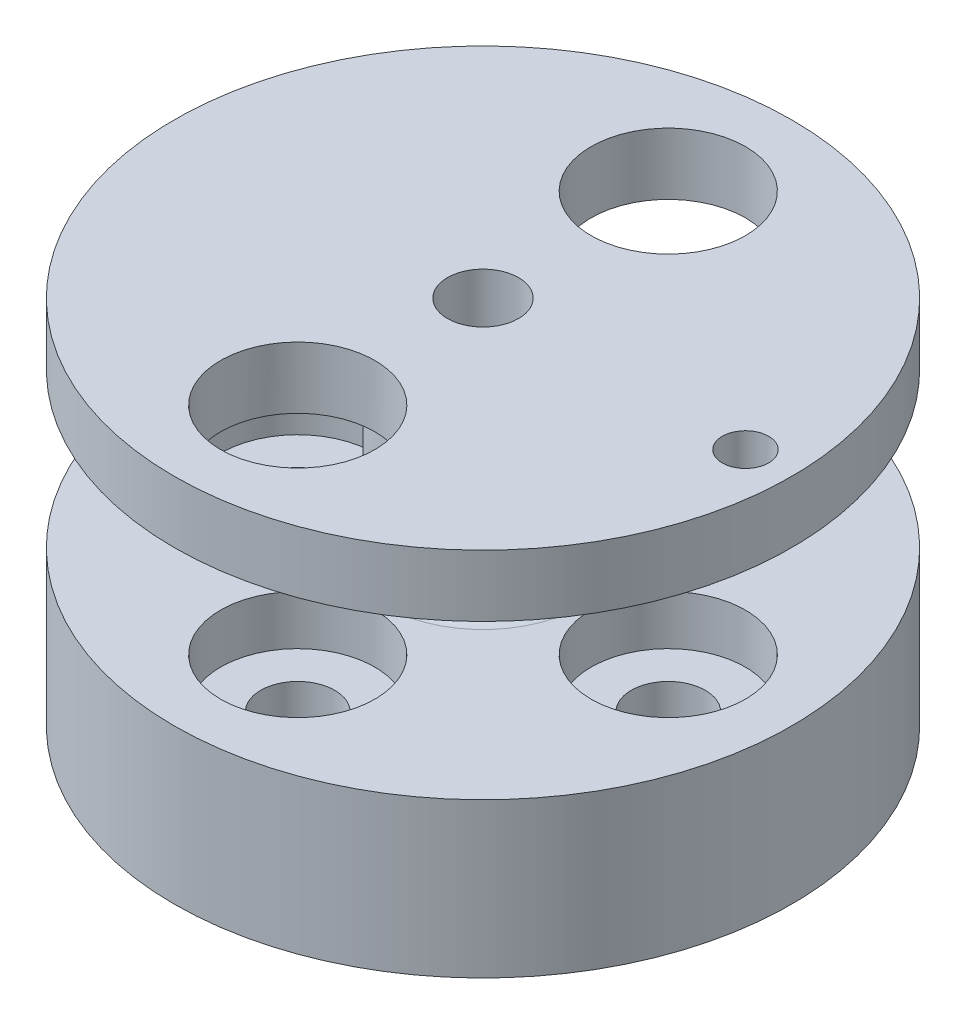
ISO-10303-21;
HEADER;
FILE_DESCRIPTION(('STEP AP214'),'2;1');
FILE_NAME('part.step','',(''),(''),'','','');
FILE_SCHEMA(('AUTOMOTIVE_DESIGN { 1 0 10303 214 1 1 1 1 }'));
ENDSEC;
DATA;
#1=APPLICATION_CONTEXT('core data for automotive mechanical design processes');
#2=APPLICATION_PROTOCOL_DEFINITION('international standard','automotive_design',2000,#1);
#3=PRODUCT_CONTEXT('',#1,'mechanical');
#4=PRODUCT('Part','Part','',(#3));
#5=PRODUCT_RELATED_PRODUCT_CATEGORY('part','',(#4));
#6=PRODUCT_DEFINITION_FORMATION('','',#4);
#7=PRODUCT_DEFINITION_CONTEXT('part definition',#1,'design');
#8=PRODUCT_DEFINITION('design','',#6,#7);
#9=PRODUCT_DEFINITION_SHAPE('','',#8);
#10=(LENGTH_UNIT() NAMED_UNIT(*) SI_UNIT(.MILLI.,.METRE.));
#11=(NAMED_UNIT(*) PLANE_ANGLE_UNIT() SI_UNIT($,.RADIAN.));
#12=(NAMED_UNIT(*) SI_UNIT($,.STERADIAN.) SOLID_ANGLE_UNIT());
#13=UNCERTAINTY_MEASURE_WITH_UNIT(LENGTH_MEASURE(1.E-05),#10,'distance_accuracy_value','');
#14=(GEOMETRIC_REPRESENTATION_CONTEXT(3) GLOBAL_UNCERTAINTY_ASSIGNED_CONTEXT((#13)) GLOBAL_UNIT_ASSIGNED_CONTEXT((#10,
#11,#12)) REPRESENTATION_CONTEXT('',''));
#15=CARTESIAN_POINT('',(0.,0.,0.));
#16=DIRECTION('',(0.,0.,1.));
#17=DIRECTION('',(1.,0.,0.));
#18=AXIS2_PLACEMENT_3D('',#15,#16,#17);
#19=CARTESIAN_POINT('',(0.,10.,10.));
#20=DIRECTION('',(0.,-1.,0.));
#21=DIRECTION('',(0.,0.,-1.));
#22=AXIS2_PLACEMENT_3D('',#19,#20,#21);
#23=PLANE('',#22);
#24=CARTESIAN_POINT('',(0.,10.,-6.));
#25=DIRECTION('',(0.,-1.,0.));
#26=DIRECTION('',(0.,0.,-1.));
#27=AXIS2_PLACEMENT_3D('',#24,#25,#26);
#28=CIRCLE('',#27,2.5);
#29=CARTESIAN_POINT('',(0.,10.,-8.5));
#30=VERTEX_POINT('',#29);
#31=EDGE_CURVE('E81',#30,#30,#28,.F.);
#32=ORIENTED_EDGE('',*,*,#31,.T.);
#33=EDGE_LOOP('',(#32));
#34=FACE_BOUND('',#33,.T.);
#35=CARTESIAN_POINT('',(0.,10.,6.));
#36=DIRECTION('',(0.,-1.,0.));
#37=DIRECTION('',(0.,0.,-1.));
#38=AXIS2_PLACEMENT_3D('',#35,#36,#37);
#39=CIRCLE('',#38,2.5);
#40=CARTESIAN_POINT('',(0.,10.,3.5));
#41=VERTEX_POINT('',#40);
#42=EDGE_CURVE('E75',#41,#41,#39,.F.);
#43=ORIENTED_EDGE('',*,*,#42,.T.);
#44=EDGE_LOOP('',(#43));
#45=FACE_BOUND('',#44,.T.);
#46=CARTESIAN_POINT('',(0.,10.,0.));
#47=DIRECTION('',(0.,-1.,0.));
#48=DIRECTION('',(0.,0.,-1.));
#49=AXIS2_PLACEMENT_3D('',#46,#47,#48);
#50=CIRCLE('',#49,1.15);
#51=CARTESIAN_POINT('',(0.,10.,-1.15));
#52=VERTEX_POINT('',#51);
#53=EDGE_CURVE('E56',#52,#52,#50,.T.);
#54=ORIENTED_EDGE('',*,*,#53,.F.);
#55=EDGE_LOOP('',(#54));
#56=FACE_BOUND('',#55,.T.);
#57=CARTESIAN_POINT('',(8.5,10.,0.));
#58=DIRECTION('',(0.,1.,0.));
#59=DIRECTION('',(0.,0.,1.));
#60=AXIS2_PLACEMENT_3D('',#57,#58,#59);
#61=CIRCLE('',#60,0.75);
#62=CARTESIAN_POINT('',(8.5,10.,0.75));
#63=VERTEX_POINT('',#62);
#64=EDGE_CURVE('E64',#63,#63,#61,.F.);
#65=ORIENTED_EDGE('',*,*,#64,.F.);
#66=EDGE_LOOP('',(#65));
#67=FACE_BOUND('',#66,.T.);
#68=CARTESIAN_POINT('',(0.,10.,0.));
#69=DIRECTION('',(0.,1.,0.));
#70=DIRECTION('',(0.,0.,1.));
#71=AXIS2_PLACEMENT_3D('',#68,#69,#70);
#72=CIRCLE('',#71,10.);
#73=CARTESIAN_POINT('',(0.,10.,10.));
#74=VERTEX_POINT('',#73);
#75=EDGE_CURVE('E69',#74,#74,#72,.T.);
#76=ORIENTED_EDGE('',*,*,#75,.F.);
#77=EDGE_LOOP('',(#76));
#78=FACE_BOUND('',#77,.T.);
#79=ADVANCED_FACE('F52',(#34,#45,#56,#67,#78),#23,.T.);
#80=CARTESIAN_POINT('',(0.,12.,0.));
#81=DIRECTION('',(0.,1.,0.));
#82=DIRECTION('',(0.,0.,1.));
#83=AXIS2_PLACEMENT_3D('',#80,#81,#82);
#84=PLANE('',#83);
#85=CARTESIAN_POINT('',(0.,12.,-6.));
#86=DIRECTION('',(0.,1.,0.));
#87=DIRECTION('',(0.,0.,-1.));
#88=AXIS2_PLACEMENT_3D('',#85,#86,#87);
#89=CIRCLE('',#88,2.5);
#90=CARTESIAN_POINT('',(0.,12.,-8.5));
#91=VERTEX_POINT('',#90);
#92=EDGE_CURVE('E84',#91,#91,#89,.T.);
#93=ORIENTED_EDGE('',*,*,#92,.F.);
#94=EDGE_LOOP('',(#93));
#95=FACE_BOUND('',#94,.T.);
#96=CARTESIAN_POINT('',(0.,12.,6.));
#97=DIRECTION('',(0.,1.,0.));
#98=DIRECTION('',(0.,0.,1.));
#99=AXIS2_PLACEMENT_3D('',#96,#97,#98);
#100=CIRCLE('',#99,2.5);
#101=CARTESIAN_POINT('',(0.,12.,8.5));
#102=VERTEX_POINT('',#101);
#103=EDGE_CURVE('E78',#102,#102,#100,.T.);
#104=ORIENTED_EDGE('',*,*,#103,.F.);
#105=EDGE_LOOP('',(#104));
#106=FACE_BOUND('',#105,.T.);
#107=CARTESIAN_POINT('',(0.,12.,0.));
#108=DIRECTION('',(0.,1.,0.));
#109=DIRECTION('',(0.,0.,1.));
#110=AXIS2_PLACEMENT_3D('',#107,#108,#109);
#111=CIRCLE('',#110,1.15);
#112=CARTESIAN_POINT('',(0.,12.,1.15));
#113=VERTEX_POINT('',#112);
#114=EDGE_CURVE('E12',#113,#113,#111,.T.);
#115=ORIENTED_EDGE('',*,*,#114,.F.);
#116=EDGE_LOOP('',(#115));
#117=FACE_BOUND('',#116,.T.);
#118=CARTESIAN_POINT('',(8.5,12.,0.));
#119=DIRECTION('',(0.,1.,0.));
#120=DIRECTION('',(0.,0.,1.));
#121=AXIS2_PLACEMENT_3D('',#118,#119,#120);
#122=CIRCLE('',#121,0.75);
#123=CARTESIAN_POINT('',(8.5,12.,0.75));
#124=VERTEX_POINT('',#123);
#125=EDGE_CURVE('E60',#124,#124,#122,.T.);
#126=ORIENTED_EDGE('',*,*,#125,.F.);
#127=EDGE_LOOP('',(#126));
#128=FACE_BOUND('',#127,.T.);
#129=CARTESIAN_POINT('',(0.,12.,0.));
#130=DIRECTION('',(0.,1.,0.));
#131=DIRECTION('',(0.,0.,1.));
#132=AXIS2_PLACEMENT_3D('',#129,#130,#131);
#133=CIRCLE('',#132,10.);
#134=CARTESIAN_POINT('',(0.,12.,10.));
#135=VERTEX_POINT('',#134);
#136=EDGE_CURVE('E70',#135,#135,#133,.T.);
#137=ORIENTED_EDGE('',*,*,#136,.T.);
#138=EDGE_LOOP('',(#137));
#139=FACE_BOUND('',#138,.T.);
#140=ADVANCED_FACE('F91',(#95,#106,#117,#128,#139),#84,.T.);
#141=CARTESIAN_POINT('',(0.,15.2526911934581,0.));
#142=DIRECTION('',(0.,-1.,0.));
#143=DIRECTION('',(0.,0.,-1.));
#144=AXIS2_PLACEMENT_3D('',#141,#142,#143);
#145=CYLINDRICAL_SURFACE('',#144,1.15);
#146=ORIENTED_EDGE('',*,*,#114,.T.);
#147=EDGE_LOOP('',(#146));
#148=FACE_BOUND('',#147,.T.);
#149=ORIENTED_EDGE('',*,*,#53,.T.);
#150=EDGE_LOOP('',(#149));
#151=FACE_BOUND('',#150,.T.);
#152=ADVANCED_FACE('F54',(#148,#151),#145,.F.);
#153=CARTESIAN_POINT('',(8.5,7.87867965644036,0.));
#154=DIRECTION('',(0.,1.,0.));
#155=DIRECTION('',(0.,0.,1.));
#156=AXIS2_PLACEMENT_3D('',#153,#154,#155);
#157=CYLINDRICAL_SURFACE('',#156,0.75);
#158=ORIENTED_EDGE('',*,*,#64,.T.);
#159=EDGE_LOOP('',(#158));
#160=FACE_BOUND('',#159,.T.);
#161=ORIENTED_EDGE('',*,*,#125,.T.);
#162=EDGE_LOOP('',(#161));
#163=FACE_BOUND('',#162,.T.);
#164=ADVANCED_FACE('F106',(#160,#163),#157,.F.);
#165=CARTESIAN_POINT('',(0.,12.,0.));
#166=DIRECTION('',(0.,-1.,0.));
#167=DIRECTION('',(0.,0.,-1.));
#168=AXIS2_PLACEMENT_3D('',#165,#166,#167);
#169=CYLINDRICAL_SURFACE('',#168,10.);
#170=ORIENTED_EDGE('',*,*,#136,.F.);
#171=EDGE_LOOP('',(#170));
#172=FACE_BOUND('',#171,.T.);
#173=ORIENTED_EDGE('',*,*,#75,.T.);
#174=EDGE_LOOP('',(#173));
#175=FACE_BOUND('',#174,.T.);
#176=ADVANCED_FACE('F102',(#172,#175),#169,.T.);
#177=CARTESIAN_POINT('',(0.,2.92893218813453,6.));
#178=DIRECTION('',(0.,1.,0.));
#179=DIRECTION('',(0.,0.,1.));
#180=AXIS2_PLACEMENT_3D('',#177,#178,#179);
#181=CYLINDRICAL_SURFACE('',#180,2.5);
#182=ORIENTED_EDGE('',*,*,#103,.T.);
#183=EDGE_LOOP('',(#182));
#184=FACE_BOUND('',#183,.T.);
#185=ORIENTED_EDGE('',*,*,#42,.F.);
#186=EDGE_LOOP('',(#185));
#187=FACE_BOUND('',#186,.T.);
#188=ADVANCED_FACE('F105',(#184,#187),#181,.F.);
#189=CARTESIAN_POINT('',(0.,2.92893218813453,-6.));
#190=DIRECTION('',(0.,1.,0.));
#191=DIRECTION('',(0.,0.,1.));
#192=AXIS2_PLACEMENT_3D('',#189,#190,#191);
#193=CYLINDRICAL_SURFACE('',#192,2.5);
#194=ORIENTED_EDGE('',*,*,#92,.T.);
#195=EDGE_LOOP('',(#194));
#196=FACE_BOUND('',#195,.T.);
#197=ORIENTED_EDGE('',*,*,#31,.F.);
#198=EDGE_LOOP('',(#197));
#199=FACE_BOUND('',#198,.T.);
#200=ADVANCED_FACE('F88',(#196,#199),#193,.F.);
#201=CLOSED_SHELL('',(#79,#140,#152,#164,#176,#188,#200));
#202=MANIFOLD_SOLID_BREP('B2',#201);
#203=CARTESIAN_POINT('',(0.,10.,10.));
#204=DIRECTION('',(0.,-1.,0.));
#205=DIRECTION('',(0.,0.,-1.));
#206=AXIS2_PLACEMENT_3D('',#203,#204,#205);
#207=PLANE('',#206);
#208=CARTESIAN_POINT('',(0.,10.,0.));
#209=DIRECTION('',(0.,1.,0.));
#210=DIRECTION('',(0.,0.,1.));
#211=AXIS2_PLACEMENT_3D('',#208,#209,#210);
#212=CIRCLE('',#211,2.75);
#213=CARTESIAN_POINT('',(0.,10.,2.75));
#214=VERTEX_POINT('',#213);
#215=EDGE_CURVE('E51',#214,#214,#212,.T.);
#216=ORIENTED_EDGE('',*,*,#215,.T.);
#217=EDGE_LOOP('',(#216));
#218=FACE_BOUND('',#217,.T.);
#219=CARTESIAN_POINT('',(0.,10.,0.));
#220=DIRECTION('',(0.,-1.,0.));
#221=DIRECTION('',(0.,0.,-1.));
#222=AXIS2_PLACEMENT_3D('',#219,#220,#221);
#223=CIRCLE('',#222,1.15);
#224=CARTESIAN_POINT('',(0.,10.,-1.15));
#225=VERTEX_POINT('',#224);
#226=EDGE_CURVE('E183',#225,#225,#223,.T.);
#227=ORIENTED_EDGE('',*,*,#226,.T.);
#228=EDGE_LOOP('',(#227));
#229=FACE_BOUND('',#228,.T.);
#230=ADVANCED_FACE('F180',(#218,#229),#207,.F.);
#231=CARTESIAN_POINT('',(0.,5.,0.));
#232=DIRECTION('',(0.,1.,0.));
#233=DIRECTION('',(0.,0.,1.));
#234=AXIS2_PLACEMENT_3D('',#231,#232,#233);
#235=PLANE('',#234);
#236=CARTESIAN_POINT('',(0.,5.,0.));
#237=DIRECTION('',(0.,1.,0.));
#238=DIRECTION('',(0.,0.,1.));
#239=AXIS2_PLACEMENT_3D('',#236,#237,#238);
#240=CIRCLE('',#239,1.15);
#241=CARTESIAN_POINT('',(0.,5.,1.15));
#242=VERTEX_POINT('',#241);
#243=EDGE_CURVE('E272',#242,#242,#240,.T.);
#244=ORIENTED_EDGE('',*,*,#243,.T.);
#245=EDGE_LOOP('',(#244));
#246=FACE_BOUND('',#245,.T.);
#247=ADVANCED_FACE('F256',(#246),#235,.T.);
#248=CARTESIAN_POINT('',(0.,15.2526911934581,0.));
#249=DIRECTION('',(0.,-1.,0.));
#250=DIRECTION('',(0.,0.,-1.));
#251=AXIS2_PLACEMENT_3D('',#248,#249,#250);
#252=CYLINDRICAL_SURFACE('',#251,1.15);
#253=ORIENTED_EDGE('',*,*,#226,.F.);
#254=EDGE_LOOP('',(#253));
#255=FACE_BOUND('',#254,.T.);
#256=ORIENTED_EDGE('',*,*,#243,.F.);
#257=EDGE_LOOP('',(#256));
#258=FACE_BOUND('',#257,.T.);
#259=ADVANCED_FACE('F261',(#255,#258),#252,.F.);
#260=CARTESIAN_POINT('',(0.,5.,0.));
#261=DIRECTION('',(0.,-1.,0.));
#262=DIRECTION('',(0.,0.,-1.));
#263=AXIS2_PLACEMENT_3D('',#260,#261,#262);
#264=CYLINDRICAL_SURFACE('',#263,10.);
#265=CARTESIAN_POINT('',(0.,5.,0.));
#266=DIRECTION('',(0.,1.,0.));
#267=DIRECTION('',(0.,0.,1.));
#268=AXIS2_PLACEMENT_3D('',#265,#266,#267);
#269=CIRCLE('',#268,10.);
#270=CARTESIAN_POINT('',(0.,5.,10.));
#271=VERTEX_POINT('',#270);
#272=EDGE_CURVE('E215',#271,#271,#269,.T.);
#273=ORIENTED_EDGE('',*,*,#272,.F.);
#274=EDGE_LOOP('',(#273));
#275=FACE_BOUND('',#274,.T.);
#276=CARTESIAN_POINT('',(0.,0.,0.));
#277=DIRECTION('',(0.,1.,0.));
#278=DIRECTION('',(0.,0.,1.));
#279=AXIS2_PLACEMENT_3D('',#276,#277,#278);
#280=CIRCLE('',#279,10.);
#281=CARTESIAN_POINT('',(0.,0.,10.));
#282=VERTEX_POINT('',#281);
#283=EDGE_CURVE('E214',#282,#282,#280,.T.);
#284=ORIENTED_EDGE('',*,*,#283,.T.);
#285=EDGE_LOOP('',(#284));
#286=FACE_BOUND('',#285,.T.);
#287=ADVANCED_FACE('F268',(#275,#286),#264,.T.);
#288=CARTESIAN_POINT('',(0.,5.,0.));
#289=DIRECTION('',(0.,1.,0.));
#290=DIRECTION('',(0.,0.,1.));
#291=AXIS2_PLACEMENT_3D('',#288,#289,#290);
#292=PLANE('',#291);
#293=CARTESIAN_POINT('',(0.,5.,0.));
#294=DIRECTION('',(0.,1.,0.));
#295=DIRECTION('',(0.,0.,1.));
#296=AXIS2_PLACEMENT_3D('',#293,#294,#295);
#297=CIRCLE('',#296,3.25);
#298=CARTESIAN_POINT('',(0.,5.,3.25));
#299=VERTEX_POINT('',#298);
#300=EDGE_CURVE('E193',#299,#299,#297,.F.);
#301=ORIENTED_EDGE('',*,*,#300,.T.);
#302=EDGE_LOOP('',(#301));
#303=FACE_BOUND('',#302,.T.);
#304=CARTESIAN_POINT('',(0.,5.,6.));
#305=DIRECTION('',(0.,1.,0.));
#306=DIRECTION('',(0.,0.,1.));
#307=AXIS2_PLACEMENT_3D('',#304,#305,#306);
#308=CIRCLE('',#307,2.5);
#309=CARTESIAN_POINT('',(0.,5.,8.5));
#310=VERTEX_POINT('',#309);
#311=EDGE_CURVE('E274',#310,#310,#308,.T.);
#312=ORIENTED_EDGE('',*,*,#311,.F.);
#313=EDGE_LOOP('',(#312));
#314=FACE_BOUND('',#313,.T.);
#315=CARTESIAN_POINT('',(-6.,5.,0.));
#316=DIRECTION('',(0.,1.,0.));
#317=DIRECTION('',(0.,0.,1.));
#318=AXIS2_PLACEMENT_3D('',#315,#316,#317);
#319=CIRCLE('',#318,2.5);
#320=CARTESIAN_POINT('',(-6.,5.,2.5));
#321=VERTEX_POINT('',#320);
#322=EDGE_CURVE('E292',#321,#321,#319,.T.);
#323=ORIENTED_EDGE('',*,*,#322,.F.);
#324=EDGE_LOOP('',(#323));
#325=FACE_BOUND('',#324,.T.);
#326=CARTESIAN_POINT('',(0.,5.,-6.));
#327=DIRECTION('',(0.,1.,0.));
#328=DIRECTION('',(0.,0.,1.));
#329=AXIS2_PLACEMENT_3D('',#326,#327,#328);
#330=CIRCLE('',#329,2.5);
#331=CARTESIAN_POINT('',(0.,5.,-3.5));
#332=VERTEX_POINT('',#331);
#333=EDGE_CURVE('E308',#332,#332,#330,.T.);
#334=ORIENTED_EDGE('',*,*,#333,.F.);
#335=EDGE_LOOP('',(#334));
#336=FACE_BOUND('',#335,.T.);
#337=CARTESIAN_POINT('',(6.,5.,0.));
#338=DIRECTION('',(0.,1.,0.));
#339=DIRECTION('',(0.,0.,1.));
#340=AXIS2_PLACEMENT_3D('',#337,#338,#339);
#341=CIRCLE('',#340,2.5);
#342=CARTESIAN_POINT('',(6.,5.,2.5));
#343=VERTEX_POINT('',#342);
#344=EDGE_CURVE('E198',#343,#343,#341,.T.);
#345=ORIENTED_EDGE('',*,*,#344,.F.);
#346=EDGE_LOOP('',(#345));
#347=FACE_BOUND('',#346,.T.);
#348=ORIENTED_EDGE('',*,*,#272,.T.);
#349=EDGE_LOOP('',(#348));
#350=FACE_BOUND('',#349,.T.);
#351=ADVANCED_FACE('F229',(#303,#314,#325,#336,#347,#350),#292,.T.);
#352=CARTESIAN_POINT('',(0.,0.,0.));
#353=DIRECTION('',(0.,1.,0.));
#354=DIRECTION('',(0.,0.,1.));
#355=AXIS2_PLACEMENT_3D('',#352,#353,#354);
#356=PLANE('',#355);
#357=CARTESIAN_POINT('',(0.,0.,6.));
#358=DIRECTION('',(0.,1.,0.));
#359=DIRECTION('',(0.,0.,1.));
#360=AXIS2_PLACEMENT_3D('',#357,#358,#359);
#361=CIRCLE('',#360,1.2);
#362=CARTESIAN_POINT('',(0.,0.,7.2));
#363=VERTEX_POINT('',#362);
#364=EDGE_CURVE('E288',#363,#363,#361,.T.);
#365=ORIENTED_EDGE('',*,*,#364,.T.);
#366=EDGE_LOOP('',(#365));
#367=FACE_BOUND('',#366,.T.);
#368=CARTESIAN_POINT('',(-6.,0.,0.));
#369=DIRECTION('',(0.,1.,0.));
#370=DIRECTION('',(0.,0.,1.));
#371=AXIS2_PLACEMENT_3D('',#368,#369,#370);
#372=CIRCLE('',#371,1.2);
#373=CARTESIAN_POINT('',(-6.,0.,1.2));
#374=VERTEX_POINT('',#373);
#375=EDGE_CURVE('E304',#374,#374,#372,.T.);
#376=ORIENTED_EDGE('',*,*,#375,.T.);
#377=EDGE_LOOP('',(#376));
#378=FACE_BOUND('',#377,.T.);
#379=CARTESIAN_POINT('',(0.,0.,-6.));
#380=DIRECTION('',(0.,1.,0.));
#381=DIRECTION('',(0.,0.,1.));
#382=AXIS2_PLACEMENT_3D('',#379,#380,#381);
#383=CIRCLE('',#382,1.2);
#384=CARTESIAN_POINT('',(0.,0.,-4.8));
#385=VERTEX_POINT('',#384);
#386=EDGE_CURVE('E196',#385,#385,#383,.T.);
#387=ORIENTED_EDGE('',*,*,#386,.T.);
#388=EDGE_LOOP('',(#387));
#389=FACE_BOUND('',#388,.T.);
#390=CARTESIAN_POINT('',(6.,0.,0.));
#391=DIRECTION('',(0.,1.,0.));
#392=DIRECTION('',(0.,0.,1.));
#393=AXIS2_PLACEMENT_3D('',#390,#391,#392);
#394=CIRCLE('',#393,1.2);
#395=CARTESIAN_POINT('',(6.,0.,1.2));
#396=VERTEX_POINT('',#395);
#397=EDGE_CURVE('E210',#396,#396,#394,.T.);
#398=ORIENTED_EDGE('',*,*,#397,.T.);
#399=EDGE_LOOP('',(#398));
#400=FACE_BOUND('',#399,.T.);
#401=ORIENTED_EDGE('',*,*,#283,.F.);
#402=EDGE_LOOP('',(#401));
#403=FACE_BOUND('',#402,.T.);
#404=ADVANCED_FACE('F324',(#367,#378,#389,#400,#403),#356,.F.);
#405=CARTESIAN_POINT('',(6.,5.,0.));
#406=DIRECTION('',(0.,1.,0.));
#407=DIRECTION('',(0.,0.,1.));
#408=AXIS2_PLACEMENT_3D('',#405,#406,#407);
#409=CYLINDRICAL_SURFACE('',#408,1.2);
#410=ORIENTED_EDGE('',*,*,#397,.F.);
#411=EDGE_LOOP('',(#410));
#412=FACE_BOUND('',#411,.T.);
#413=CARTESIAN_POINT('',(6.,3.4,0.));
#414=DIRECTION('',(0.,1.,0.));
#415=DIRECTION('',(0.,0.,1.));
#416=AXIS2_PLACEMENT_3D('',#413,#414,#415);
#417=CIRCLE('',#416,1.2);
#418=CARTESIAN_POINT('',(6.,3.4,1.2));
#419=VERTEX_POINT('',#418);
#420=EDGE_CURVE('E206',#419,#419,#417,.T.);
#421=ORIENTED_EDGE('',*,*,#420,.T.);
#422=EDGE_LOOP('',(#421));
#423=FACE_BOUND('',#422,.T.);
#424=ADVANCED_FACE('F327',(#412,#423),#409,.F.);
#425=CARTESIAN_POINT('',(7.2,3.4,0.));
#426=DIRECTION('',(0.,-1.,0.));
#427=DIRECTION('',(0.,0.,-1.));
#428=AXIS2_PLACEMENT_3D('',#425,#426,#427);
#429=PLANE('',#428);
#430=ORIENTED_EDGE('',*,*,#420,.F.);
#431=EDGE_LOOP('',(#430));
#432=FACE_BOUND('',#431,.T.);
#433=CARTESIAN_POINT('',(6.,3.4,0.));
#434=DIRECTION('',(0.,1.,0.));
#435=DIRECTION('',(0.,0.,1.));
#436=AXIS2_PLACEMENT_3D('',#433,#434,#435);
#437=CIRCLE('',#436,2.5);
#438=CARTESIAN_POINT('',(6.,3.4,2.5));
#439=VERTEX_POINT('',#438);
#440=EDGE_CURVE('E202',#439,#439,#437,.T.);
#441=ORIENTED_EDGE('',*,*,#440,.T.);
#442=EDGE_LOOP('',(#441));
#443=FACE_BOUND('',#442,.T.);
#444=ADVANCED_FACE('F252',(#432,#443),#429,.F.);
#445=CARTESIAN_POINT('',(6.,5.,0.));
#446=DIRECTION('',(0.,1.,0.));
#447=DIRECTION('',(0.,0.,1.));
#448=AXIS2_PLACEMENT_3D('',#445,#446,#447);
#449=CYLINDRICAL_SURFACE('',#448,2.5);
#450=ORIENTED_EDGE('',*,*,#440,.F.);
#451=EDGE_LOOP('',(#450));
#452=FACE_BOUND('',#451,.T.);
#453=ORIENTED_EDGE('',*,*,#344,.T.);
#454=EDGE_LOOP('',(#453));
#455=FACE_BOUND('',#454,.T.);
#456=ADVANCED_FACE('F242',(#452,#455),#449,.F.);
#457=CARTESIAN_POINT('',(0.,10.,0.));
#458=DIRECTION('',(0.,-1.,0.));
#459=DIRECTION('',(0.,0.,-1.));
#460=AXIS2_PLACEMENT_3D('',#457,#458,#459);
#461=CYLINDRICAL_SURFACE('',#460,2.75);
#462=CARTESIAN_POINT('',(0.,5.5,0.));
#463=DIRECTION('',(0.,1.,0.));
#464=DIRECTION('',(0.,0.,1.));
#465=AXIS2_PLACEMENT_3D('',#462,#463,#464);
#466=CIRCLE('',#465,2.75);
#467=CARTESIAN_POINT('',(0.,5.5,2.75));
#468=VERTEX_POINT('',#467);
#469=EDGE_CURVE('E219',#468,#468,#466,.T.);
#470=ORIENTED_EDGE('',*,*,#469,.T.);
#471=EDGE_LOOP('',(#470));
#472=FACE_BOUND('',#471,.T.);
#473=ORIENTED_EDGE('',*,*,#215,.F.);
#474=EDGE_LOOP('',(#473));
#475=FACE_BOUND('',#474,.T.);
#476=ADVANCED_FACE('F238',(#472,#475),#461,.T.);
#477=CARTESIAN_POINT('',(0.,5.,-6.));
#478=DIRECTION('',(0.,1.,0.));
#479=DIRECTION('',(0.,0.,1.));
#480=AXIS2_PLACEMENT_3D('',#477,#478,#479);
#481=CYLINDRICAL_SURFACE('',#480,1.2);
#482=ORIENTED_EDGE('',*,*,#386,.F.);
#483=EDGE_LOOP('',(#482));
#484=FACE_BOUND('',#483,.T.);
#485=CARTESIAN_POINT('',(0.,3.4,-6.));
#486=DIRECTION('',(0.,1.,0.));
#487=DIRECTION('',(0.,0.,1.));
#488=AXIS2_PLACEMENT_3D('',#485,#486,#487);
#489=CIRCLE('',#488,1.2);
#490=CARTESIAN_POINT('',(0.,3.4,-4.8));
#491=VERTEX_POINT('',#490);
#492=EDGE_CURVE('E315',#491,#491,#489,.T.);
#493=ORIENTED_EDGE('',*,*,#492,.T.);
#494=EDGE_LOOP('',(#493));
#495=FACE_BOUND('',#494,.T.);
#496=ADVANCED_FACE('F241',(#484,#495),#481,.F.);
#497=CARTESIAN_POINT('',(1.19999999999998,3.4,-6.));
#498=DIRECTION('',(0.,-1.,0.));
#499=DIRECTION('',(0.,0.,-1.));
#500=AXIS2_PLACEMENT_3D('',#497,#498,#499);
#501=PLANE('',#500);
#502=ORIENTED_EDGE('',*,*,#492,.F.);
#503=EDGE_LOOP('',(#502));
#504=FACE_BOUND('',#503,.T.);
#505=CARTESIAN_POINT('',(0.,3.4,-6.));
#506=DIRECTION('',(0.,1.,0.));
#507=DIRECTION('',(0.,0.,1.));
#508=AXIS2_PLACEMENT_3D('',#505,#506,#507);
#509=CIRCLE('',#508,2.5);
#510=CARTESIAN_POINT('',(0.,3.4,-3.5));
#511=VERTEX_POINT('',#510);
#512=EDGE_CURVE('E312',#511,#511,#509,.T.);
#513=ORIENTED_EDGE('',*,*,#512,.T.);
#514=EDGE_LOOP('',(#513));
#515=FACE_BOUND('',#514,.T.);
#516=ADVANCED_FACE('F248',(#504,#515),#501,.F.);
#517=CARTESIAN_POINT('',(0.,5.,-6.));
#518=DIRECTION('',(0.,1.,0.));
#519=DIRECTION('',(0.,0.,1.));
#520=AXIS2_PLACEMENT_3D('',#517,#518,#519);
#521=CYLINDRICAL_SURFACE('',#520,2.5);
#522=ORIENTED_EDGE('',*,*,#512,.F.);
#523=EDGE_LOOP('',(#522));
#524=FACE_BOUND('',#523,.T.);
#525=ORIENTED_EDGE('',*,*,#333,.T.);
#526=EDGE_LOOP('',(#525));
#527=FACE_BOUND('',#526,.T.);
#528=ADVANCED_FACE('F382',(#524,#527),#521,.F.);
#529=CARTESIAN_POINT('',(-6.,5.,0.));
#530=DIRECTION('',(0.,1.,0.));
#531=DIRECTION('',(0.,0.,1.));
#532=AXIS2_PLACEMENT_3D('',#529,#530,#531);
#533=CYLINDRICAL_SURFACE('',#532,1.2);
#534=ORIENTED_EDGE('',*,*,#375,.F.);
#535=EDGE_LOOP('',(#534));
#536=FACE_BOUND('',#535,.T.);
#537=CARTESIAN_POINT('',(-6.,3.4,0.));
#538=DIRECTION('',(0.,1.,0.));
#539=DIRECTION('',(0.,0.,1.));
#540=AXIS2_PLACEMENT_3D('',#537,#538,#539);
#541=CIRCLE('',#540,1.2);
#542=CARTESIAN_POINT('',(-6.,3.4,1.2));
#543=VERTEX_POINT('',#542);
#544=EDGE_CURVE('E300',#543,#543,#541,.T.);
#545=ORIENTED_EDGE('',*,*,#544,.T.);
#546=EDGE_LOOP('',(#545));
#547=FACE_BOUND('',#546,.T.);
#548=ADVANCED_FACE('F391',(#536,#547),#533,.F.);
#549=CARTESIAN_POINT('',(-4.8,3.4,0.));
#550=DIRECTION('',(0.,-1.,0.));
#551=DIRECTION('',(0.,0.,-1.));
#552=AXIS2_PLACEMENT_3D('',#549,#550,#551);
#553=PLANE('',#552);
#554=ORIENTED_EDGE('',*,*,#544,.F.);
#555=EDGE_LOOP('',(#554));
#556=FACE_BOUND('',#555,.T.);
#557=CARTESIAN_POINT('',(-6.,3.4,0.));
#558=DIRECTION('',(0.,1.,0.));
#559=DIRECTION('',(0.,0.,1.));
#560=AXIS2_PLACEMENT_3D('',#557,#558,#559);
#561=CIRCLE('',#560,2.5);
#562=CARTESIAN_POINT('',(-6.,3.4,2.5));
#563=VERTEX_POINT('',#562);
#564=EDGE_CURVE('E296',#563,#563,#561,.T.);
#565=ORIENTED_EDGE('',*,*,#564,.T.);
#566=EDGE_LOOP('',(#565));
#567=FACE_BOUND('',#566,.T.);
#568=ADVANCED_FACE('F400',(#556,#567),#553,.F.);
#569=CARTESIAN_POINT('',(-6.,5.,0.));
#570=DIRECTION('',(0.,1.,0.));
#571=DIRECTION('',(0.,0.,1.));
#572=AXIS2_PLACEMENT_3D('',#569,#570,#571);
#573=CYLINDRICAL_SURFACE('',#572,2.5);
#574=ORIENTED_EDGE('',*,*,#564,.F.);
#575=EDGE_LOOP('',(#574));
#576=FACE_BOUND('',#575,.T.);
#577=ORIENTED_EDGE('',*,*,#322,.T.);
#578=EDGE_LOOP('',(#577));
#579=FACE_BOUND('',#578,.T.);
#580=ADVANCED_FACE('F409',(#576,#579),#573,.F.);
#581=CARTESIAN_POINT('',(0.,5.,6.));
#582=DIRECTION('',(0.,1.,0.));
#583=DIRECTION('',(0.,0.,1.));
#584=AXIS2_PLACEMENT_3D('',#581,#582,#583);
#585=CYLINDRICAL_SURFACE('',#584,1.2);
#586=ORIENTED_EDGE('',*,*,#364,.F.);
#587=EDGE_LOOP('',(#586));
#588=FACE_BOUND('',#587,.T.);
#589=CARTESIAN_POINT('',(0.,3.4,6.));
#590=DIRECTION('',(0.,1.,0.));
#591=DIRECTION('',(0.,0.,1.));
#592=AXIS2_PLACEMENT_3D('',#589,#590,#591);
#593=CIRCLE('',#592,1.2);
#594=CARTESIAN_POINT('',(0.,3.4,7.2));
#595=VERTEX_POINT('',#594);
#596=EDGE_CURVE('E284',#595,#595,#593,.T.);
#597=ORIENTED_EDGE('',*,*,#596,.T.);
#598=EDGE_LOOP('',(#597));
#599=FACE_BOUND('',#598,.T.);
#600=ADVANCED_FACE('F418',(#588,#599),#585,.F.);
#601=CARTESIAN_POINT('',(1.20000000000006,3.4,6.));
#602=DIRECTION('',(0.,-1.,0.));
#603=DIRECTION('',(0.,0.,-1.));
#604=AXIS2_PLACEMENT_3D('',#601,#602,#603);
#605=PLANE('',#604);
#606=ORIENTED_EDGE('',*,*,#596,.F.);
#607=EDGE_LOOP('',(#606));
#608=FACE_BOUND('',#607,.T.);
#609=CARTESIAN_POINT('',(0.,3.4,6.));
#610=DIRECTION('',(0.,1.,0.));
#611=DIRECTION('',(0.,0.,1.));
#612=AXIS2_PLACEMENT_3D('',#609,#610,#611);
#613=CIRCLE('',#612,2.5);
#614=CARTESIAN_POINT('',(0.,3.4,8.5));
#615=VERTEX_POINT('',#614);
#616=EDGE_CURVE('E278',#615,#615,#613,.T.);
#617=ORIENTED_EDGE('',*,*,#616,.T.);
#618=EDGE_LOOP('',(#617));
#619=FACE_BOUND('',#618,.T.);
#620=ADVANCED_FACE('F427',(#608,#619),#605,.F.);
#621=CARTESIAN_POINT('',(0.,5.,6.));
#622=DIRECTION('',(0.,1.,0.));
#623=DIRECTION('',(0.,0.,1.));
#624=AXIS2_PLACEMENT_3D('',#621,#622,#623);
#625=CYLINDRICAL_SURFACE('',#624,2.5);
#626=ORIENTED_EDGE('',*,*,#616,.F.);
#627=EDGE_LOOP('',(#626));
#628=FACE_BOUND('',#627,.T.);
#629=ORIENTED_EDGE('',*,*,#311,.T.);
#630=EDGE_LOOP('',(#629));
#631=FACE_BOUND('',#630,.T.);
#632=ADVANCED_FACE('F235',(#628,#631),#625,.F.);
#633=CARTESIAN_POINT('',(0.,5.5,0.));
#634=DIRECTION('',(0.,1.,0.));
#635=DIRECTION('',(0.,0.,1.));
#636=AXIS2_PLACEMENT_3D('',#633,#634,#635);
#637=TOROIDAL_SURFACE('',#636,3.25,0.5);
#638=ORIENTED_EDGE('',*,*,#300,.F.);
#639=EDGE_LOOP('',(#638));
#640=FACE_BOUND('',#639,.T.);
#641=ORIENTED_EDGE('',*,*,#469,.F.);
#642=EDGE_LOOP('',(#641));
#643=FACE_BOUND('',#642,.T.);
#644=ADVANCED_FACE('F232',(#640,#643),#637,.F.);
#645=CLOSED_SHELL('',(#230,#247,#259,#287,#351,#404,#424,#444,#456,#476,#496,#516,#528,#548,
#568,#580,#600,#620,#632,#644));
#646=MANIFOLD_SOLID_BREP('B7',#645);
#647=ADVANCED_BREP_SHAPE_REPRESENTATION('',(#18,#202,#646),#14);
#648=SHAPE_DEFINITION_REPRESENTATION(#9,#647);
ENDSEC;
END-ISO-10303-21;
